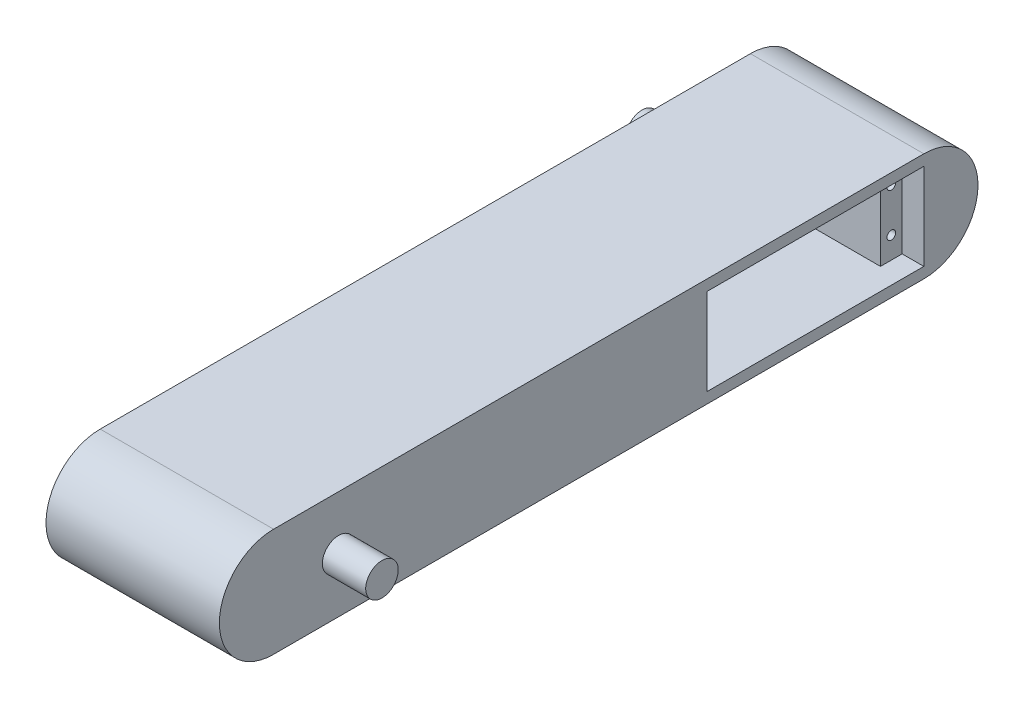
ISO-10303-21;
HEADER;
FILE_DESCRIPTION(('STEP AP214'),'2;1');
FILE_NAME('part.step','',(''),(''),'','','');
FILE_SCHEMA(('AUTOMOTIVE_DESIGN { 1 0 10303 214 1 1 1 1 }'));
ENDSEC;
DATA;
#1=APPLICATION_CONTEXT('core data for automotive mechanical design processes');
#2=APPLICATION_PROTOCOL_DEFINITION('international standard','automotive_design',2000,#1);
#3=PRODUCT_CONTEXT('',#1,'mechanical');
#4=PRODUCT('Part','Part','',(#3));
#5=PRODUCT_RELATED_PRODUCT_CATEGORY('part','',(#4));
#6=PRODUCT_DEFINITION_FORMATION('','',#4);
#7=PRODUCT_DEFINITION_CONTEXT('part definition',#1,'design');
#8=PRODUCT_DEFINITION('design','',#6,#7);
#9=PRODUCT_DEFINITION_SHAPE('','',#8);
#10=(LENGTH_UNIT() NAMED_UNIT(*) SI_UNIT(.MILLI.,.METRE.));
#11=(NAMED_UNIT(*) PLANE_ANGLE_UNIT() SI_UNIT($,.RADIAN.));
#12=(NAMED_UNIT(*) SI_UNIT($,.STERADIAN.) SOLID_ANGLE_UNIT());
#13=UNCERTAINTY_MEASURE_WITH_UNIT(LENGTH_MEASURE(1.E-05),#10,'distance_accuracy_value','');
#14=(GEOMETRIC_REPRESENTATION_CONTEXT(3) GLOBAL_UNCERTAINTY_ASSIGNED_CONTEXT((#13)) GLOBAL_UNIT_ASSIGNED_CONTEXT((#10,
#11,#12)) REPRESENTATION_CONTEXT('',''));
#15=CARTESIAN_POINT('',(0.,0.,0.));
#16=DIRECTION('',(0.,0.,1.));
#17=DIRECTION('',(1.,0.,0.));
#18=AXIS2_PLACEMENT_3D('',#15,#16,#17);
#19=CARTESIAN_POINT('',(17.5,0.,0.));
#20=DIRECTION('',(1.,0.,0.));
#21=DIRECTION('',(0.,0.,-1.));
#22=AXIS2_PLACEMENT_3D('',#19,#20,#21);
#23=PLANE('',#22);
#24=CARTESIAN_POINT('',(17.5,15.,-122.5));
#25=DIRECTION('',(1.,0.,0.));
#26=DIRECTION('',(0.,0.,-1.));
#27=AXIS2_PLACEMENT_3D('',#24,#25,#26);
#28=CIRCLE('',#27,0.999999999999987);
#29=CARTESIAN_POINT('',(17.5,15.,-123.5));
#30=VERTEX_POINT('',#29);
#31=EDGE_CURVE('E220',#30,#30,#28,.T.);
#32=ORIENTED_EDGE('',*,*,#31,.F.);
#33=EDGE_LOOP('',(#32));
#34=FACE_BOUND('',#33,.T.);
#35=CARTESIAN_POINT('',(17.5,5.,-122.5));
#36=DIRECTION('',(1.,0.,0.));
#37=DIRECTION('',(0.,0.,-1.));
#38=AXIS2_PLACEMENT_3D('',#35,#36,#37);
#39=CIRCLE('',#38,0.999999999999989);
#40=CARTESIAN_POINT('',(17.5,5.,-123.5));
#41=VERTEX_POINT('',#40);
#42=EDGE_CURVE('E226',#41,#41,#39,.T.);
#43=ORIENTED_EDGE('',*,*,#42,.F.);
#44=EDGE_LOOP('',(#43));
#45=FACE_BOUND('',#44,.T.);
#46=DIRECTION('',(0.,1.,0.));
#47=VECTOR('',#46,1.);
#48=CARTESIAN_POINT('',(17.5,0.,-120.));
#49=LINE('',#48,#47);
#50=CARTESIAN_POINT('',(17.5,0.,-120.));
#51=VERTEX_POINT('',#50);
#52=CARTESIAN_POINT('',(17.5,20.,-120.));
#53=VERTEX_POINT('',#52);
#54=EDGE_CURVE('E11',#51,#53,#49,.T.);
#55=ORIENTED_EDGE('',*,*,#54,.F.);
#56=DIRECTION('',(0.,0.,1.));
#57=VECTOR('',#56,1.);
#58=CARTESIAN_POINT('',(17.5,0.,-125.));
#59=LINE('',#58,#57);
#60=CARTESIAN_POINT('',(17.5,0.,-125.));
#61=VERTEX_POINT('',#60);
#62=EDGE_CURVE('E260',#61,#51,#59,.T.);
#63=ORIENTED_EDGE('',*,*,#62,.F.);
#64=DIRECTION('',(0.,-1.,0.));
#65=VECTOR('',#64,1.);
#66=CARTESIAN_POINT('',(17.5,20.,-125.));
#67=LINE('',#66,#65);
#68=CARTESIAN_POINT('',(17.5,20.,-125.));
#69=VERTEX_POINT('',#68);
#70=EDGE_CURVE('E263',#69,#61,#67,.T.);
#71=ORIENTED_EDGE('',*,*,#70,.F.);
#72=DIRECTION('',(0.,0.,1.));
#73=VECTOR('',#72,1.);
#74=CARTESIAN_POINT('',(17.5,20.,-125.));
#75=LINE('',#74,#73);
#76=EDGE_CURVE('E252',#69,#53,#75,.T.);
#77=ORIENTED_EDGE('',*,*,#76,.T.);
#78=EDGE_LOOP('',(#55,#63,#71,#77));
#79=FACE_BOUND('',#78,.T.);
#80=ADVANCED_FACE('F38',(#34,#45,#79),#23,.T.);
#81=CARTESIAN_POINT('',(-12.5,20.,0.));
#82=DIRECTION('',(1.,0.,0.));
#83=DIRECTION('',(0.,0.,-1.));
#84=AXIS2_PLACEMENT_3D('',#81,#82,#83);
#85=PLANE('',#84);
#86=CARTESIAN_POINT('',(-12.5,5.,22.5));
#87=DIRECTION('',(-1.,0.,0.));
#88=DIRECTION('',(0.,0.,1.));
#89=AXIS2_PLACEMENT_3D('',#86,#87,#88);
#90=CIRCLE('',#89,0.999999999999989);
#91=CARTESIAN_POINT('',(-12.5,5.,23.5));
#92=VERTEX_POINT('',#91);
#93=EDGE_CURVE('E357',#92,#92,#90,.T.);
#94=ORIENTED_EDGE('',*,*,#93,.F.);
#95=EDGE_LOOP('',(#94));
#96=FACE_BOUND('',#95,.T.);
#97=CARTESIAN_POINT('',(-12.5,15.,22.5));
#98=DIRECTION('',(-1.,0.,0.));
#99=DIRECTION('',(0.,0.,1.));
#100=AXIS2_PLACEMENT_3D('',#97,#98,#99);
#101=CIRCLE('',#100,0.999999999999987);
#102=CARTESIAN_POINT('',(-12.5,15.,23.5));
#103=VERTEX_POINT('',#102);
#104=EDGE_CURVE('E349',#103,#103,#101,.T.);
#105=ORIENTED_EDGE('',*,*,#104,.F.);
#106=EDGE_LOOP('',(#105));
#107=FACE_BOUND('',#106,.T.);
#108=DIRECTION('',(0.,-1.,0.));
#109=VECTOR('',#108,1.);
#110=CARTESIAN_POINT('',(-12.5,20.,20.));
#111=LINE('',#110,#109);
#112=CARTESIAN_POINT('',(-12.5,20.,20.));
#113=VERTEX_POINT('',#112);
#114=CARTESIAN_POINT('',(-12.5,0.,20.));
#115=VERTEX_POINT('',#114);
#116=EDGE_CURVE('E392',#113,#115,#111,.T.);
#117=ORIENTED_EDGE('',*,*,#116,.T.);
#118=DIRECTION('',(0.,0.,1.));
#119=VECTOR('',#118,1.);
#120=CARTESIAN_POINT('',(-12.5,0.,0.));
#121=LINE('',#120,#119);
#122=CARTESIAN_POINT('',(-12.5,0.,25.));
#123=VERTEX_POINT('',#122);
#124=EDGE_CURVE('E315',#115,#123,#121,.T.);
#125=ORIENTED_EDGE('',*,*,#124,.T.);
#126=DIRECTION('',(0.,-1.,0.));
#127=VECTOR('',#126,1.);
#128=CARTESIAN_POINT('',(-12.5,20.,25.));
#129=LINE('',#128,#127);
#130=CARTESIAN_POINT('',(-12.5,20.,25.));
#131=VERTEX_POINT('',#130);
#132=EDGE_CURVE('E384',#131,#123,#129,.T.);
#133=ORIENTED_EDGE('',*,*,#132,.F.);
#134=DIRECTION('',(0.,0.,1.));
#135=VECTOR('',#134,1.);
#136=CARTESIAN_POINT('',(-12.5,20.,0.));
#137=LINE('',#136,#135);
#138=EDGE_CURVE('E319',#113,#131,#137,.T.);
#139=ORIENTED_EDGE('',*,*,#138,.F.);
#140=EDGE_LOOP('',(#117,#125,#133,#139));
#141=FACE_BOUND('',#140,.T.);
#142=ADVANCED_FACE('F415',(#96,#107,#141),#85,.F.);
#143=CARTESIAN_POINT('',(22.5,20.,0.));
#144=DIRECTION('',(1.,0.,0.));
#145=DIRECTION('',(0.,0.,-1.));
#146=AXIS2_PLACEMENT_3D('',#143,#144,#145);
#147=PLANE('',#146);
#148=DIRECTION('',(0.,0.,1.));
#149=VECTOR('',#148,1.);
#150=CARTESIAN_POINT('',(22.5,20.,-125.));
#151=LINE('',#150,#149);
#152=CARTESIAN_POINT('',(22.5,20.,-125.));
#153=VERTEX_POINT('',#152);
#154=CARTESIAN_POINT('',(22.5,20.,-75.));
#155=VERTEX_POINT('',#154);
#156=EDGE_CURVE('E59',#153,#155,#151,.T.);
#157=ORIENTED_EDGE('',*,*,#156,.F.);
#158=DIRECTION('',(0.,-1.,0.));
#159=VECTOR('',#158,1.);
#160=CARTESIAN_POINT('',(22.5,20.,-125.));
#161=LINE('',#160,#159);
#162=CARTESIAN_POINT('',(22.5,0.,-125.));
#163=VERTEX_POINT('',#162);
#164=EDGE_CURVE('E272',#153,#163,#161,.T.);
#165=ORIENTED_EDGE('',*,*,#164,.T.);
#166=DIRECTION('',(0.,0.,1.));
#167=VECTOR('',#166,1.);
#168=CARTESIAN_POINT('',(22.5,0.,-125.));
#169=LINE('',#168,#167);
#170=CARTESIAN_POINT('',(22.5,0.,-75.));
#171=VERTEX_POINT('',#170);
#172=EDGE_CURVE('E270',#163,#171,#169,.T.);
#173=ORIENTED_EDGE('',*,*,#172,.T.);
#174=DIRECTION('',(0.,-1.,0.));
#175=VECTOR('',#174,1.);
#176=CARTESIAN_POINT('',(22.5,20.,-75.));
#177=LINE('',#176,#175);
#178=EDGE_CURVE('E267',#155,#171,#177,.T.);
#179=ORIENTED_EDGE('',*,*,#178,.F.);
#180=EDGE_LOOP('',(#157,#165,#173,#179));
#181=FACE_BOUND('',#180,.T.);
#182=CARTESIAN_POINT('',(22.5,10.,9.99999999999999));
#183=DIRECTION('',(1.,0.,0.));
#184=DIRECTION('',(0.,0.,-1.));
#185=AXIS2_PLACEMENT_3D('',#182,#183,#184);
#186=CIRCLE('',#185,3.75);
#187=CARTESIAN_POINT('',(22.5,10.,6.25));
#188=VERTEX_POINT('',#187);
#189=EDGE_CURVE('E345',#188,#188,#186,.T.);
#190=ORIENTED_EDGE('',*,*,#189,.F.);
#191=EDGE_LOOP('',(#190));
#192=FACE_BOUND('',#191,.T.);
#193=DIRECTION('',(0.,0.,-1.));
#194=VECTOR('',#193,1.);
#195=CARTESIAN_POINT('',(22.5,22.5,25.));
#196=LINE('',#195,#194);
#197=CARTESIAN_POINT('',(22.5,22.5,25.));
#198=VERTEX_POINT('',#197);
#199=CARTESIAN_POINT('',(22.5,22.5,-125.));
#200=VERTEX_POINT('',#199);
#201=EDGE_CURVE('E339',#198,#200,#196,.T.);
#202=ORIENTED_EDGE('',*,*,#201,.F.);
#203=CARTESIAN_POINT('',(22.5,10.,25.));
#204=DIRECTION('',(1.,0.,0.));
#205=DIRECTION('',(0.,0.,-1.));
#206=AXIS2_PLACEMENT_3D('',#203,#204,#205);
#207=CIRCLE('',#206,12.5);
#208=CARTESIAN_POINT('',(22.5,-2.5,25.));
#209=VERTEX_POINT('',#208);
#210=EDGE_CURVE('E277',#198,#209,#207,.T.);
#211=ORIENTED_EDGE('',*,*,#210,.T.);
#212=DIRECTION('',(0.,0.,1.));
#213=VECTOR('',#212,1.);
#214=CARTESIAN_POINT('',(22.5,-2.5,-25.));
#215=LINE('',#214,#213);
#216=CARTESIAN_POINT('',(22.5,-2.49999999999999,-125.));
#217=VERTEX_POINT('',#216);
#218=EDGE_CURVE('E333',#217,#209,#215,.T.);
#219=ORIENTED_EDGE('',*,*,#218,.F.);
#220=CARTESIAN_POINT('',(22.5,10.,-125.));
#221=DIRECTION('',(1.,0.,0.));
#222=DIRECTION('',(0.,0.,-1.));
#223=AXIS2_PLACEMENT_3D('',#220,#221,#222);
#224=CIRCLE('',#223,12.5);
#225=EDGE_CURVE('E288',#200,#217,#224,.F.);
#226=ORIENTED_EDGE('',*,*,#225,.F.);
#227=EDGE_LOOP('',(#202,#211,#219,#226));
#228=FACE_BOUND('',#227,.T.);
#229=ADVANCED_FACE('F40',(#181,#192,#228),#147,.T.);
#230=CARTESIAN_POINT('',(0.,20.,-20.));
#231=DIRECTION('',(0.,0.,-1.));
#232=DIRECTION('',(-1.,0.,0.));
#233=AXIS2_PLACEMENT_3D('',#230,#231,#232);
#234=PLANE('',#233);
#235=DIRECTION('',(1.,0.,0.));
#236=VECTOR('',#235,1.);
#237=CARTESIAN_POINT('',(0.,0.,-20.));
#238=LINE('',#237,#236);
#239=CARTESIAN_POINT('',(-12.5,0.,-20.));
#240=VERTEX_POINT('',#239);
#241=CARTESIAN_POINT('',(17.5,0.,-20.));
#242=VERTEX_POINT('',#241);
#243=EDGE_CURVE('E375',#240,#242,#238,.T.);
#244=ORIENTED_EDGE('',*,*,#243,.T.);
#245=DIRECTION('',(0.,-1.,0.));
#246=VECTOR('',#245,1.);
#247=CARTESIAN_POINT('',(17.5,20.,-20.));
#248=LINE('',#247,#246);
#249=CARTESIAN_POINT('',(17.5,20.,-20.));
#250=VERTEX_POINT('',#249);
#251=EDGE_CURVE('E398',#250,#242,#248,.T.);
#252=ORIENTED_EDGE('',*,*,#251,.F.);
#253=DIRECTION('',(1.,0.,0.));
#254=VECTOR('',#253,1.);
#255=CARTESIAN_POINT('',(0.,20.,-20.));
#256=LINE('',#255,#254);
#257=CARTESIAN_POINT('',(-12.5,20.,-20.));
#258=VERTEX_POINT('',#257);
#259=EDGE_CURVE('E376',#258,#250,#256,.T.);
#260=ORIENTED_EDGE('',*,*,#259,.F.);
#261=DIRECTION('',(0.,-1.,0.));
#262=VECTOR('',#261,1.);
#263=CARTESIAN_POINT('',(-12.5,20.,-20.));
#264=LINE('',#263,#262);
#265=EDGE_CURVE('E401',#258,#240,#264,.T.);
#266=ORIENTED_EDGE('',*,*,#265,.T.);
#267=EDGE_LOOP('',(#244,#252,#260,#266));
#268=FACE_BOUND('',#267,.T.);
#269=ADVANCED_FACE('F437',(#268),#234,.F.);
#270=CARTESIAN_POINT('',(17.5,20.,0.));
#271=DIRECTION('',(1.,0.,0.));
#272=DIRECTION('',(0.,0.,-1.));
#273=AXIS2_PLACEMENT_3D('',#270,#271,#272);
#274=PLANE('',#273);
#275=DIRECTION('',(0.,0.,1.));
#276=VECTOR('',#275,1.);
#277=CARTESIAN_POINT('',(17.5,0.,0.));
#278=LINE('',#277,#276);
#279=CARTESIAN_POINT('',(17.5,0.,20.));
#280=VERTEX_POINT('',#279);
#281=EDGE_CURVE('E387',#242,#280,#278,.T.);
#282=ORIENTED_EDGE('',*,*,#281,.T.);
#283=DIRECTION('',(0.,-1.,0.));
#284=VECTOR('',#283,1.);
#285=CARTESIAN_POINT('',(17.5,20.,20.));
#286=LINE('',#285,#284);
#287=CARTESIAN_POINT('',(17.5,20.,20.));
#288=VERTEX_POINT('',#287);
#289=EDGE_CURVE('E395',#288,#280,#286,.T.);
#290=ORIENTED_EDGE('',*,*,#289,.F.);
#291=DIRECTION('',(0.,0.,1.));
#292=VECTOR('',#291,1.);
#293=CARTESIAN_POINT('',(17.5,20.,0.));
#294=LINE('',#293,#292);
#295=EDGE_CURVE('E378',#250,#288,#294,.T.);
#296=ORIENTED_EDGE('',*,*,#295,.F.);
#297=ORIENTED_EDGE('',*,*,#251,.T.);
#298=EDGE_LOOP('',(#282,#290,#296,#297));
#299=FACE_BOUND('',#298,.T.);
#300=ADVANCED_FACE('F441',(#299),#274,.F.);
#301=CARTESIAN_POINT('',(0.,20.,20.));
#302=DIRECTION('',(0.,0.,-1.));
#303=DIRECTION('',(-1.,0.,0.));
#304=AXIS2_PLACEMENT_3D('',#301,#302,#303);
#305=PLANE('',#304);
#306=DIRECTION('',(1.,0.,0.));
#307=VECTOR('',#306,1.);
#308=CARTESIAN_POINT('',(0.,0.,20.));
#309=LINE('',#308,#307);
#310=EDGE_CURVE('E379',#115,#280,#309,.T.);
#311=ORIENTED_EDGE('',*,*,#310,.F.);
#312=ORIENTED_EDGE('',*,*,#116,.F.);
#313=DIRECTION('',(1.,0.,0.));
#314=VECTOR('',#313,1.);
#315=CARTESIAN_POINT('',(0.,20.,20.));
#316=LINE('',#315,#314);
#317=EDGE_CURVE('E381',#113,#288,#316,.T.);
#318=ORIENTED_EDGE('',*,*,#317,.T.);
#319=ORIENTED_EDGE('',*,*,#289,.T.);
#320=EDGE_LOOP('',(#311,#312,#318,#319));
#321=FACE_BOUND('',#320,.T.);
#322=ADVANCED_FACE('F444',(#321),#305,.T.);
#323=DIRECTION('',(0.,-1.,0.));
#324=VECTOR('',#323,1.);
#325=CARTESIAN_POINT('',(-12.5,0.,-25.));
#326=LINE('',#325,#324);
#327=CARTESIAN_POINT('',(-12.5,20.,-25.));
#328=VERTEX_POINT('',#327);
#329=CARTESIAN_POINT('',(-12.5,0.,-25.));
#330=VERTEX_POINT('',#329);
#331=EDGE_CURVE('E314',#328,#330,#326,.T.);
#332=ORIENTED_EDGE('',*,*,#331,.T.);
#333=EDGE_CURVE('E294',#330,#240,#121,.T.);
#334=ORIENTED_EDGE('',*,*,#333,.T.);
#335=ORIENTED_EDGE('',*,*,#265,.F.);
#336=EDGE_CURVE('E300',#328,#258,#137,.T.);
#337=ORIENTED_EDGE('',*,*,#336,.F.);
#338=EDGE_LOOP('',(#332,#334,#335,#337));
#339=FACE_BOUND('',#338,.T.);
#340=CARTESIAN_POINT('',(-12.5,15.,-22.5));
#341=DIRECTION('',(-1.,0.,0.));
#342=DIRECTION('',(0.,0.,1.));
#343=AXIS2_PLACEMENT_3D('',#340,#341,#342);
#344=CIRCLE('',#343,0.999999999999987);
#345=CARTESIAN_POINT('',(-12.5,15.,-21.5));
#346=VERTEX_POINT('',#345);
#347=EDGE_CURVE('E363',#346,#346,#344,.T.);
#348=ORIENTED_EDGE('',*,*,#347,.F.);
#349=EDGE_LOOP('',(#348));
#350=FACE_BOUND('',#349,.T.);
#351=CARTESIAN_POINT('',(-12.5,5.,-22.5));
#352=DIRECTION('',(-1.,0.,0.));
#353=DIRECTION('',(0.,0.,1.));
#354=AXIS2_PLACEMENT_3D('',#351,#352,#353);
#355=CIRCLE('',#354,0.999999999999989);
#356=CARTESIAN_POINT('',(-12.5,5.,-21.5));
#357=VERTEX_POINT('',#356);
#358=EDGE_CURVE('E369',#357,#357,#355,.T.);
#359=ORIENTED_EDGE('',*,*,#358,.F.);
#360=EDGE_LOOP('',(#359));
#361=FACE_BOUND('',#360,.T.);
#362=ADVANCED_FACE('F434',(#339,#350,#361),#85,.F.);
#363=CARTESIAN_POINT('',(-2.50000000000001,5.,-22.5));
#364=DIRECTION('',(-1.,0.,0.));
#365=DIRECTION('',(0.,0.,1.));
#366=AXIS2_PLACEMENT_3D('',#363,#364,#365);
#367=CONICAL_SURFACE('',#366,0.999999999999987,1.02974425867664);
#368=CARTESIAN_POINT('',(-1.89913938097244,5.,-22.5));
#369=VERTEX_POINT('',#368);
#370=VERTEX_LOOP('',#369);
#371=FACE_BOUND('',#370,.T.);
#372=CARTESIAN_POINT('',(-2.50000000000001,5.,-22.5));
#373=DIRECTION('',(-1.,0.,0.));
#374=DIRECTION('',(0.,0.,1.));
#375=AXIS2_PLACEMENT_3D('',#372,#373,#374);
#376=CIRCLE('',#375,0.999999999999987);
#377=CARTESIAN_POINT('',(-2.50000000000001,5.,-21.5));
#378=VERTEX_POINT('',#377);
#379=EDGE_CURVE('E372',#378,#378,#376,.T.);
#380=ORIENTED_EDGE('',*,*,#379,.T.);
#381=EDGE_LOOP('',(#380));
#382=FACE_BOUND('',#381,.T.);
#383=ADVANCED_FACE('F451',(#371,#382),#367,.F.);
#384=CARTESIAN_POINT('',(-12.5,5.,-22.5));
#385=DIRECTION('',(-1.,0.,0.));
#386=DIRECTION('',(0.,0.,1.));
#387=AXIS2_PLACEMENT_3D('',#384,#385,#386);
#388=CYLINDRICAL_SURFACE('',#387,0.999999999999988);
#389=ORIENTED_EDGE('',*,*,#379,.F.);
#390=EDGE_LOOP('',(#389));
#391=FACE_BOUND('',#390,.T.);
#392=ORIENTED_EDGE('',*,*,#358,.T.);
#393=EDGE_LOOP('',(#392));
#394=FACE_BOUND('',#393,.T.);
#395=ADVANCED_FACE('F578',(#391,#394),#388,.F.);
#396=CARTESIAN_POINT('',(-2.50000000000001,15.,-22.5));
#397=DIRECTION('',(-1.,0.,0.));
#398=DIRECTION('',(0.,0.,1.));
#399=AXIS2_PLACEMENT_3D('',#396,#397,#398);
#400=CONICAL_SURFACE('',#399,0.999999999999987,1.02974425867664);
#401=CARTESIAN_POINT('',(-1.89913938097244,15.,-22.5));
#402=VERTEX_POINT('',#401);
#403=VERTEX_LOOP('',#402);
#404=FACE_BOUND('',#403,.T.);
#405=CARTESIAN_POINT('',(-2.50000000000001,15.,-22.5));
#406=DIRECTION('',(-1.,0.,0.));
#407=DIRECTION('',(0.,0.,1.));
#408=AXIS2_PLACEMENT_3D('',#405,#406,#407);
#409=CIRCLE('',#408,0.999999999999987);
#410=CARTESIAN_POINT('',(-2.50000000000001,15.,-21.5));
#411=VERTEX_POINT('',#410);
#412=EDGE_CURVE('E366',#411,#411,#409,.T.);
#413=ORIENTED_EDGE('',*,*,#412,.T.);
#414=EDGE_LOOP('',(#413));
#415=FACE_BOUND('',#414,.T.);
#416=ADVANCED_FACE('F574',(#404,#415),#400,.F.);
#417=CARTESIAN_POINT('',(-12.5,15.,-22.5));
#418=DIRECTION('',(-1.,0.,0.));
#419=DIRECTION('',(0.,0.,1.));
#420=AXIS2_PLACEMENT_3D('',#417,#418,#419);
#421=CYLINDRICAL_SURFACE('',#420,0.999999999999987);
#422=ORIENTED_EDGE('',*,*,#412,.F.);
#423=EDGE_LOOP('',(#422));
#424=FACE_BOUND('',#423,.T.);
#425=ORIENTED_EDGE('',*,*,#347,.T.);
#426=EDGE_LOOP('',(#425));
#427=FACE_BOUND('',#426,.T.);
#428=ADVANCED_FACE('F570',(#424,#427),#421,.F.);
#429=CARTESIAN_POINT('',(-2.50000000000001,5.,22.5));
#430=DIRECTION('',(-1.,0.,0.));
#431=DIRECTION('',(0.,0.,1.));
#432=AXIS2_PLACEMENT_3D('',#429,#430,#431);
#433=CONICAL_SURFACE('',#432,0.999999999999987,1.02974425867664);
#434=CARTESIAN_POINT('',(-1.89913938097244,5.,22.5));
#435=VERTEX_POINT('',#434);
#436=VERTEX_LOOP('',#435);
#437=FACE_BOUND('',#436,.T.);
#438=CARTESIAN_POINT('',(-2.50000000000001,5.,22.5));
#439=DIRECTION('',(-1.,0.,0.));
#440=DIRECTION('',(0.,0.,1.));
#441=AXIS2_PLACEMENT_3D('',#438,#439,#440);
#442=CIRCLE('',#441,0.999999999999987);
#443=CARTESIAN_POINT('',(-2.50000000000001,5.,23.5));
#444=VERTEX_POINT('',#443);
#445=EDGE_CURVE('E360',#444,#444,#442,.T.);
#446=ORIENTED_EDGE('',*,*,#445,.T.);
#447=EDGE_LOOP('',(#446));
#448=FACE_BOUND('',#447,.T.);
#449=ADVANCED_FACE('F566',(#437,#448),#433,.F.);
#450=CARTESIAN_POINT('',(-12.5,5.,22.5));
#451=DIRECTION('',(-1.,0.,0.));
#452=DIRECTION('',(0.,0.,1.));
#453=AXIS2_PLACEMENT_3D('',#450,#451,#452);
#454=CYLINDRICAL_SURFACE('',#453,0.999999999999988);
#455=ORIENTED_EDGE('',*,*,#445,.F.);
#456=EDGE_LOOP('',(#455));
#457=FACE_BOUND('',#456,.T.);
#458=ORIENTED_EDGE('',*,*,#93,.T.);
#459=EDGE_LOOP('',(#458));
#460=FACE_BOUND('',#459,.T.);
#461=ADVANCED_FACE('F562',(#457,#460),#454,.F.);
#462=CARTESIAN_POINT('',(-2.50000000000001,15.,22.5));
#463=DIRECTION('',(-1.,0.,0.));
#464=DIRECTION('',(0.,0.,1.));
#465=AXIS2_PLACEMENT_3D('',#462,#463,#464);
#466=CONICAL_SURFACE('',#465,0.999999999999987,1.02974425867664);
#467=CARTESIAN_POINT('',(-1.89913938097244,15.,22.5));
#468=VERTEX_POINT('',#467);
#469=VERTEX_LOOP('',#468);
#470=FACE_BOUND('',#469,.T.);
#471=CARTESIAN_POINT('',(-2.50000000000001,15.,22.5));
#472=DIRECTION('',(-1.,0.,0.));
#473=DIRECTION('',(0.,0.,1.));
#474=AXIS2_PLACEMENT_3D('',#471,#472,#473);
#475=CIRCLE('',#474,0.999999999999987);
#476=CARTESIAN_POINT('',(-2.50000000000001,15.,23.5));
#477=VERTEX_POINT('',#476);
#478=EDGE_CURVE('E354',#477,#477,#475,.T.);
#479=ORIENTED_EDGE('',*,*,#478,.T.);
#480=EDGE_LOOP('',(#479));
#481=FACE_BOUND('',#480,.T.);
#482=ADVANCED_FACE('F558',(#470,#481),#466,.F.);
#483=CARTESIAN_POINT('',(-12.5,15.,22.5));
#484=DIRECTION('',(-1.,0.,0.));
#485=DIRECTION('',(0.,0.,1.));
#486=AXIS2_PLACEMENT_3D('',#483,#484,#485);
#487=CYLINDRICAL_SURFACE('',#486,0.999999999999987);
#488=ORIENTED_EDGE('',*,*,#478,.F.);
#489=EDGE_LOOP('',(#488));
#490=FACE_BOUND('',#489,.T.);
#491=ORIENTED_EDGE('',*,*,#104,.T.);
#492=EDGE_LOOP('',(#491));
#493=FACE_BOUND('',#492,.T.);
#494=ADVANCED_FACE('F554',(#490,#493),#487,.F.);
#495=CARTESIAN_POINT('',(32.5,10.,9.99999999999999));
#496=DIRECTION('',(-1.,0.,0.));
#497=DIRECTION('',(0.,0.,1.));
#498=AXIS2_PLACEMENT_3D('',#495,#496,#497);
#499=CYLINDRICAL_SURFACE('',#498,3.75);
#500=CARTESIAN_POINT('',(32.5,10.,9.99999999999999));
#501=DIRECTION('',(1.,0.,0.));
#502=DIRECTION('',(0.,0.,-1.));
#503=AXIS2_PLACEMENT_3D('',#500,#501,#502);
#504=CIRCLE('',#503,3.75);
#505=CARTESIAN_POINT('',(32.5,10.,6.24999999999999));
#506=VERTEX_POINT('',#505);
#507=EDGE_CURVE('E346',#506,#506,#504,.T.);
#508=ORIENTED_EDGE('',*,*,#507,.F.);
#509=EDGE_LOOP('',(#508));
#510=FACE_BOUND('',#509,.T.);
#511=ORIENTED_EDGE('',*,*,#189,.T.);
#512=EDGE_LOOP('',(#511));
#513=FACE_BOUND('',#512,.T.);
#514=ADVANCED_FACE('F550',(#510,#513),#499,.T.);
#515=CARTESIAN_POINT('',(32.5,0.,0.));
#516=DIRECTION('',(1.,0.,0.));
#517=DIRECTION('',(0.,0.,-1.));
#518=AXIS2_PLACEMENT_3D('',#515,#516,#517);
#519=PLANE('',#518);
#520=ORIENTED_EDGE('',*,*,#507,.T.);
#521=EDGE_LOOP('',(#520));
#522=FACE_BOUND('',#521,.T.);
#523=ADVANCED_FACE('F547',(#522),#519,.T.);
#524=CARTESIAN_POINT('',(0.,20.,0.));
#525=DIRECTION('',(0.,1.,0.));
#526=DIRECTION('',(0.,0.,1.));
#527=AXIS2_PLACEMENT_3D('',#524,#525,#526);
#528=PLANE('',#527);
#529=ORIENTED_EDGE('',*,*,#317,.F.);
#530=ORIENTED_EDGE('',*,*,#138,.T.);
#531=DIRECTION('',(1.,0.,0.));
#532=VECTOR('',#531,1.);
#533=CARTESIAN_POINT('',(-17.5,20.,25.));
#534=LINE('',#533,#532);
#535=CARTESIAN_POINT('',(-17.5,20.,25.));
#536=VERTEX_POINT('',#535);
#537=EDGE_CURVE('E322',#536,#131,#534,.T.);
#538=ORIENTED_EDGE('',*,*,#537,.F.);
#539=DIRECTION('',(0.,0.,1.));
#540=VECTOR('',#539,1.);
#541=CARTESIAN_POINT('',(-17.5,20.,0.));
#542=LINE('',#541,#540);
#543=CARTESIAN_POINT('',(-17.5,20.,-25.));
#544=VERTEX_POINT('',#543);
#545=EDGE_CURVE('E303',#544,#536,#542,.T.);
#546=ORIENTED_EDGE('',*,*,#545,.F.);
#547=DIRECTION('',(1.,0.,0.));
#548=VECTOR('',#547,1.);
#549=CARTESIAN_POINT('',(-17.5,20.,-25.));
#550=LINE('',#549,#548);
#551=EDGE_CURVE('E324',#544,#328,#550,.T.);
#552=ORIENTED_EDGE('',*,*,#551,.T.);
#553=ORIENTED_EDGE('',*,*,#336,.T.);
#554=ORIENTED_EDGE('',*,*,#259,.T.);
#555=ORIENTED_EDGE('',*,*,#295,.T.);
#556=EDGE_LOOP('',(#529,#530,#538,#546,#552,#553,#554,#555));
#557=FACE_BOUND('',#556,.T.);
#558=ADVANCED_FACE('F412',(#557),#528,.F.);
#559=CARTESIAN_POINT('',(0.,22.5,0.));
#560=DIRECTION('',(0.,1.,0.));
#561=DIRECTION('',(0.,0.,1.));
#562=AXIS2_PLACEMENT_3D('',#559,#560,#561);
#563=PLANE('',#562);
#564=ORIENTED_EDGE('',*,*,#201,.T.);
#565=DIRECTION('',(1.,0.,0.));
#566=VECTOR('',#565,1.);
#567=CARTESIAN_POINT('',(-12.5,22.5,-125.));
#568=LINE('',#567,#566);
#569=CARTESIAN_POINT('',(-17.5,22.5,-125.));
#570=VERTEX_POINT('',#569);
#571=EDGE_CURVE('E329',#570,#200,#568,.T.);
#572=ORIENTED_EDGE('',*,*,#571,.F.);
#573=DIRECTION('',(0.,0.,-1.));
#574=VECTOR('',#573,1.);
#575=CARTESIAN_POINT('',(-17.5,22.5,0.));
#576=LINE('',#575,#574);
#577=CARTESIAN_POINT('',(-17.5,22.5,25.));
#578=VERTEX_POINT('',#577);
#579=EDGE_CURVE('E306',#578,#570,#576,.T.);
#580=ORIENTED_EDGE('',*,*,#579,.F.);
#581=DIRECTION('',(1.,0.,0.));
#582=VECTOR('',#581,1.);
#583=CARTESIAN_POINT('',(22.5,22.5,25.));
#584=LINE('',#583,#582);
#585=EDGE_CURVE('E342',#578,#198,#584,.T.);
#586=ORIENTED_EDGE('',*,*,#585,.T.);
#587=EDGE_LOOP('',(#564,#572,#580,#586));
#588=FACE_BOUND('',#587,.T.);
#589=ADVANCED_FACE('F514',(#588),#563,.T.);
#590=CARTESIAN_POINT('',(0.,-2.5,0.));
#591=DIRECTION('',(0.,1.,0.));
#592=DIRECTION('',(0.,0.,1.));
#593=AXIS2_PLACEMENT_3D('',#590,#591,#592);
#594=PLANE('',#593);
#595=DIRECTION('',(-1.,0.,0.));
#596=VECTOR('',#595,1.);
#597=CARTESIAN_POINT('',(-12.5,-2.5,25.));
#598=LINE('',#597,#596);
#599=CARTESIAN_POINT('',(-17.5,-2.5,25.));
#600=VERTEX_POINT('',#599);
#601=EDGE_CURVE('E336',#209,#600,#598,.T.);
#602=ORIENTED_EDGE('',*,*,#601,.T.);
#603=DIRECTION('',(0.,0.,1.));
#604=VECTOR('',#603,1.);
#605=CARTESIAN_POINT('',(-17.5,-2.5,0.));
#606=LINE('',#605,#604);
#607=CARTESIAN_POINT('',(-17.5000000000001,-2.49999999999999,-125.));
#608=VERTEX_POINT('',#607);
#609=EDGE_CURVE('E309',#608,#600,#606,.T.);
#610=ORIENTED_EDGE('',*,*,#609,.F.);
#611=DIRECTION('',(-1.,0.,0.));
#612=VECTOR('',#611,1.);
#613=CARTESIAN_POINT('',(-12.5,-2.5,-125.));
#614=LINE('',#613,#612);
#615=EDGE_CURVE('E331',#217,#608,#614,.T.);
#616=ORIENTED_EDGE('',*,*,#615,.F.);
#617=ORIENTED_EDGE('',*,*,#218,.T.);
#618=EDGE_LOOP('',(#602,#610,#616,#617));
#619=FACE_BOUND('',#618,.T.);
#620=ADVANCED_FACE('F523',(#619),#594,.F.);
#621=CARTESIAN_POINT('',(0.,0.,0.));
#622=DIRECTION('',(0.,1.,0.));
#623=DIRECTION('',(0.,0.,1.));
#624=AXIS2_PLACEMENT_3D('',#621,#622,#623);
#625=PLANE('',#624);
#626=ORIENTED_EDGE('',*,*,#243,.F.);
#627=ORIENTED_EDGE('',*,*,#333,.F.);
#628=DIRECTION('',(1.,0.,0.));
#629=VECTOR('',#628,1.);
#630=CARTESIAN_POINT('',(-17.5,0.,-25.));
#631=LINE('',#630,#629);
#632=CARTESIAN_POINT('',(-17.5,0.,-25.));
#633=VERTEX_POINT('',#632);
#634=EDGE_CURVE('E326',#633,#330,#631,.T.);
#635=ORIENTED_EDGE('',*,*,#634,.F.);
#636=DIRECTION('',(0.,0.,1.));
#637=VECTOR('',#636,1.);
#638=CARTESIAN_POINT('',(-17.5,0.,0.));
#639=LINE('',#638,#637);
#640=CARTESIAN_POINT('',(-17.5,0.,25.));
#641=VERTEX_POINT('',#640);
#642=EDGE_CURVE('E296',#633,#641,#639,.T.);
#643=ORIENTED_EDGE('',*,*,#642,.T.);
#644=DIRECTION('',(1.,0.,0.));
#645=VECTOR('',#644,1.);
#646=CARTESIAN_POINT('',(-17.5,0.,25.));
#647=LINE('',#646,#645);
#648=EDGE_CURVE('E312',#641,#123,#647,.T.);
#649=ORIENTED_EDGE('',*,*,#648,.T.);
#650=ORIENTED_EDGE('',*,*,#124,.F.);
#651=ORIENTED_EDGE('',*,*,#310,.T.);
#652=ORIENTED_EDGE('',*,*,#281,.F.);
#653=EDGE_LOOP('',(#626,#627,#635,#643,#649,#650,#651,#652));
#654=FACE_BOUND('',#653,.T.);
#655=ADVANCED_FACE('F421',(#654),#625,.T.);
#656=CARTESIAN_POINT('',(-17.5,0.,-25.));
#657=DIRECTION('',(0.,0.,1.));
#658=DIRECTION('',(0.,-1.,0.));
#659=AXIS2_PLACEMENT_3D('',#656,#657,#658);
#660=PLANE('',#659);
#661=ORIENTED_EDGE('',*,*,#331,.F.);
#662=ORIENTED_EDGE('',*,*,#551,.F.);
#663=DIRECTION('',(0.,-1.,0.));
#664=VECTOR('',#663,1.);
#665=CARTESIAN_POINT('',(-17.5,0.,-25.));
#666=LINE('',#665,#664);
#667=EDGE_CURVE('E299',#544,#633,#666,.T.);
#668=ORIENTED_EDGE('',*,*,#667,.T.);
#669=ORIENTED_EDGE('',*,*,#634,.T.);
#670=EDGE_LOOP('',(#661,#662,#668,#669));
#671=FACE_BOUND('',#670,.T.);
#672=ADVANCED_FACE('F428',(#671),#660,.T.);
#673=CARTESIAN_POINT('',(-17.5,0.,0.));
#674=DIRECTION('',(-1.,0.,0.));
#675=DIRECTION('',(0.,0.,1.));
#676=AXIS2_PLACEMENT_3D('',#673,#674,#675);
#677=PLANE('',#676);
#678=CARTESIAN_POINT('',(-17.5,10.,-110.));
#679=DIRECTION('',(-1.,0.,0.));
#680=DIRECTION('',(0.,0.,1.));
#681=AXIS2_PLACEMENT_3D('',#678,#679,#680);
#682=CIRCLE('',#681,3.75000000000001);
#683=CARTESIAN_POINT('',(-17.5,10.,-106.25));
#684=VERTEX_POINT('',#683);
#685=EDGE_CURVE('E993',#684,#684,#682,.T.);
#686=ORIENTED_EDGE('',*,*,#685,.F.);
#687=EDGE_LOOP('',(#686));
#688=FACE_BOUND('',#687,.T.);
#689=CARTESIAN_POINT('',(-17.5,10.,25.));
#690=DIRECTION('',(1.,0.,0.));
#691=DIRECTION('',(0.,0.,-1.));
#692=AXIS2_PLACEMENT_3D('',#689,#690,#691);
#693=CIRCLE('',#692,12.5);
#694=EDGE_CURVE('E284',#578,#600,#693,.T.);
#695=ORIENTED_EDGE('',*,*,#694,.F.);
#696=ORIENTED_EDGE('',*,*,#579,.T.);
#697=CARTESIAN_POINT('',(-17.5,10.,-125.));
#698=DIRECTION('',(1.,0.,0.));
#699=DIRECTION('',(0.,0.,-1.));
#700=AXIS2_PLACEMENT_3D('',#697,#698,#699);
#701=CIRCLE('',#700,12.5);
#702=EDGE_CURVE('E291',#570,#608,#701,.F.);
#703=ORIENTED_EDGE('',*,*,#702,.T.);
#704=ORIENTED_EDGE('',*,*,#609,.T.);
#705=EDGE_LOOP('',(#695,#696,#703,#704));
#706=FACE_BOUND('',#705,.T.);
#707=ORIENTED_EDGE('',*,*,#642,.F.);
#708=ORIENTED_EDGE('',*,*,#667,.F.);
#709=ORIENTED_EDGE('',*,*,#545,.T.);
#710=DIRECTION('',(0.,1.,0.));
#711=VECTOR('',#710,1.);
#712=CARTESIAN_POINT('',(-17.5,-2.5,25.));
#713=LINE('',#712,#711);
#714=EDGE_CURVE('E286',#641,#536,#713,.T.);
#715=ORIENTED_EDGE('',*,*,#714,.F.);
#716=EDGE_LOOP('',(#707,#708,#709,#715));
#717=FACE_BOUND('',#716,.T.);
#718=ADVANCED_FACE('F425',(#688,#706,#717),#677,.T.);
#719=CARTESIAN_POINT('',(-17.5,10.,-125.));
#720=DIRECTION('',(1.,0.,0.));
#721=DIRECTION('',(0.,0.,-1.));
#722=AXIS2_PLACEMENT_3D('',#719,#720,#721);
#723=CYLINDRICAL_SURFACE('',#722,12.5);
#724=ORIENTED_EDGE('',*,*,#225,.T.);
#725=ORIENTED_EDGE('',*,*,#615,.T.);
#726=ORIENTED_EDGE('',*,*,#702,.F.);
#727=ORIENTED_EDGE('',*,*,#571,.T.);
#728=EDGE_LOOP('',(#724,#725,#726,#727));
#729=FACE_BOUND('',#728,.T.);
#730=ADVANCED_FACE('F525',(#729),#723,.T.);
#731=CARTESIAN_POINT('',(-17.5,-2.5,25.));
#732=DIRECTION('',(0.,0.,-1.));
#733=DIRECTION('',(-1.,0.,0.));
#734=AXIS2_PLACEMENT_3D('',#731,#732,#733);
#735=PLANE('',#734);
#736=ORIENTED_EDGE('',*,*,#537,.T.);
#737=ORIENTED_EDGE('',*,*,#132,.T.);
#738=ORIENTED_EDGE('',*,*,#648,.F.);
#739=ORIENTED_EDGE('',*,*,#714,.T.);
#740=EDGE_LOOP('',(#736,#737,#738,#739));
#741=FACE_BOUND('',#740,.T.);
#742=ADVANCED_FACE('F418',(#741),#735,.T.);
#743=CARTESIAN_POINT('',(-17.5,10.,25.));
#744=DIRECTION('',(1.,0.,0.));
#745=DIRECTION('',(0.,0.,-1.));
#746=AXIS2_PLACEMENT_3D('',#743,#744,#745);
#747=CYLINDRICAL_SURFACE('',#746,12.5);
#748=ORIENTED_EDGE('',*,*,#210,.F.);
#749=ORIENTED_EDGE('',*,*,#585,.F.);
#750=ORIENTED_EDGE('',*,*,#694,.T.);
#751=ORIENTED_EDGE('',*,*,#601,.F.);
#752=EDGE_LOOP('',(#748,#749,#750,#751));
#753=FACE_BOUND('',#752,.T.);
#754=ADVANCED_FACE('F518',(#753),#747,.T.);
#755=CARTESIAN_POINT('',(17.5,20.,-125.));
#756=DIRECTION('',(0.,1.,0.));
#757=DIRECTION('',(0.,0.,1.));
#758=AXIS2_PLACEMENT_3D('',#755,#756,#757);
#759=PLANE('',#758);
#760=CARTESIAN_POINT('',(17.5,20.,-80.));
#761=VERTEX_POINT('',#760);
#762=CARTESIAN_POINT('',(17.5,20.,-75.));
#763=VERTEX_POINT('',#762);
#764=EDGE_CURVE('E256',#761,#763,#75,.T.);
#765=ORIENTED_EDGE('',*,*,#764,.F.);
#766=DIRECTION('',(1.,0.,0.));
#767=VECTOR('',#766,1.);
#768=CARTESIAN_POINT('',(-12.5,20.,-80.));
#769=LINE('',#768,#767);
#770=CARTESIAN_POINT('',(-12.5,20.,-80.));
#771=VERTEX_POINT('',#770);
#772=EDGE_CURVE('E249',#771,#761,#769,.T.);
#773=ORIENTED_EDGE('',*,*,#772,.F.);
#774=DIRECTION('',(0.,0.,1.));
#775=VECTOR('',#774,1.);
#776=CARTESIAN_POINT('',(-12.5,20.,-120.));
#777=LINE('',#776,#775);
#778=CARTESIAN_POINT('',(-12.5,20.,-120.));
#779=VERTEX_POINT('',#778);
#780=EDGE_CURVE('E235',#779,#771,#777,.T.);
#781=ORIENTED_EDGE('',*,*,#780,.F.);
#782=DIRECTION('',(1.,0.,0.));
#783=VECTOR('',#782,1.);
#784=CARTESIAN_POINT('',(-12.5,20.,-120.));
#785=LINE('',#784,#783);
#786=EDGE_CURVE('E53',#779,#53,#785,.T.);
#787=ORIENTED_EDGE('',*,*,#786,.T.);
#788=ORIENTED_EDGE('',*,*,#76,.F.);
#789=DIRECTION('',(1.,0.,0.));
#790=VECTOR('',#789,1.);
#791=CARTESIAN_POINT('',(17.5,20.,-125.));
#792=LINE('',#791,#790);
#793=EDGE_CURVE('E275',#69,#153,#792,.T.);
#794=ORIENTED_EDGE('',*,*,#793,.T.);
#795=ORIENTED_EDGE('',*,*,#156,.T.);
#796=DIRECTION('',(1.,0.,0.));
#797=VECTOR('',#796,1.);
#798=CARTESIAN_POINT('',(17.5,20.,-75.));
#799=LINE('',#798,#797);
#800=EDGE_CURVE('E265',#763,#155,#799,.T.);
#801=ORIENTED_EDGE('',*,*,#800,.F.);
#802=EDGE_LOOP('',(#765,#773,#781,#787,#788,#794,#795,#801));
#803=FACE_BOUND('',#802,.T.);
#804=ADVANCED_FACE('F485',(#803),#759,.F.);
#805=CARTESIAN_POINT('',(17.5,20.,-125.));
#806=DIRECTION('',(0.,0.,1.));
#807=DIRECTION('',(1.,0.,0.));
#808=AXIS2_PLACEMENT_3D('',#805,#806,#807);
#809=PLANE('',#808);
#810=ORIENTED_EDGE('',*,*,#164,.F.);
#811=ORIENTED_EDGE('',*,*,#793,.F.);
#812=ORIENTED_EDGE('',*,*,#70,.T.);
#813=DIRECTION('',(1.,0.,0.));
#814=VECTOR('',#813,1.);
#815=CARTESIAN_POINT('',(17.5,0.,-125.));
#816=LINE('',#815,#814);
#817=EDGE_CURVE('E278',#61,#163,#816,.T.);
#818=ORIENTED_EDGE('',*,*,#817,.T.);
#819=EDGE_LOOP('',(#810,#811,#812,#818));
#820=FACE_BOUND('',#819,.T.);
#821=ADVANCED_FACE('F503',(#820),#809,.T.);
#822=CARTESIAN_POINT('',(17.5,0.,-125.));
#823=DIRECTION('',(0.,1.,0.));
#824=DIRECTION('',(0.,0.,1.));
#825=AXIS2_PLACEMENT_3D('',#822,#823,#824);
#826=PLANE('',#825);
#827=DIRECTION('',(1.,0.,0.));
#828=VECTOR('',#827,1.);
#829=CARTESIAN_POINT('',(17.5,0.,-75.));
#830=LINE('',#829,#828);
#831=CARTESIAN_POINT('',(17.5,0.,-75.));
#832=VERTEX_POINT('',#831);
#833=EDGE_CURVE('E280',#832,#171,#830,.T.);
#834=ORIENTED_EDGE('',*,*,#833,.T.);
#835=ORIENTED_EDGE('',*,*,#172,.F.);
#836=ORIENTED_EDGE('',*,*,#817,.F.);
#837=ORIENTED_EDGE('',*,*,#62,.T.);
#838=DIRECTION('',(1.,0.,0.));
#839=VECTOR('',#838,1.);
#840=CARTESIAN_POINT('',(-12.5,0.,-120.));
#841=LINE('',#840,#839);
#842=CARTESIAN_POINT('',(-12.5,0.,-120.));
#843=VERTEX_POINT('',#842);
#844=EDGE_CURVE('E244',#843,#51,#841,.T.);
#845=ORIENTED_EDGE('',*,*,#844,.F.);
#846=DIRECTION('',(0.,0.,-1.));
#847=VECTOR('',#846,1.);
#848=CARTESIAN_POINT('',(-12.5,0.,-120.));
#849=LINE('',#848,#847);
#850=CARTESIAN_POINT('',(-12.5,0.,-80.));
#851=VERTEX_POINT('',#850);
#852=EDGE_CURVE('E241',#851,#843,#849,.T.);
#853=ORIENTED_EDGE('',*,*,#852,.F.);
#854=DIRECTION('',(1.,0.,0.));
#855=VECTOR('',#854,1.);
#856=CARTESIAN_POINT('',(-12.5,0.,-80.));
#857=LINE('',#856,#855);
#858=CARTESIAN_POINT('',(17.5,0.,-80.));
#859=VERTEX_POINT('',#858);
#860=EDGE_CURVE('E246',#851,#859,#857,.T.);
#861=ORIENTED_EDGE('',*,*,#860,.T.);
#862=EDGE_CURVE('E259',#859,#832,#59,.T.);
#863=ORIENTED_EDGE('',*,*,#862,.T.);
#864=EDGE_LOOP('',(#834,#835,#836,#837,#845,#853,#861,#863));
#865=FACE_BOUND('',#864,.T.);
#866=ADVANCED_FACE('F476',(#865),#826,.T.);
#867=CARTESIAN_POINT('',(17.5,20.,-75.));
#868=DIRECTION('',(0.,0.,1.));
#869=DIRECTION('',(1.,0.,0.));
#870=AXIS2_PLACEMENT_3D('',#867,#868,#869);
#871=PLANE('',#870);
#872=ORIENTED_EDGE('',*,*,#178,.T.);
#873=ORIENTED_EDGE('',*,*,#833,.F.);
#874=DIRECTION('',(0.,-1.,0.));
#875=VECTOR('',#874,1.);
#876=CARTESIAN_POINT('',(17.5,20.,-75.));
#877=LINE('',#876,#875);
#878=EDGE_CURVE('E255',#763,#832,#877,.T.);
#879=ORIENTED_EDGE('',*,*,#878,.F.);
#880=ORIENTED_EDGE('',*,*,#800,.T.);
#881=EDGE_LOOP('',(#872,#873,#879,#880));
#882=FACE_BOUND('',#881,.T.);
#883=ADVANCED_FACE('F468',(#882),#871,.F.);
#884=CARTESIAN_POINT('',(17.5,15.,-77.5));
#885=DIRECTION('',(1.,0.,0.));
#886=DIRECTION('',(0.,0.,-1.));
#887=AXIS2_PLACEMENT_3D('',#884,#885,#886);
#888=CIRCLE('',#887,0.999999999999987);
#889=CARTESIAN_POINT('',(17.5,15.,-78.5));
#890=VERTEX_POINT('',#889);
#891=EDGE_CURVE('E208',#890,#890,#888,.T.);
#892=ORIENTED_EDGE('',*,*,#891,.F.);
#893=EDGE_LOOP('',(#892));
#894=FACE_BOUND('',#893,.T.);
#895=CARTESIAN_POINT('',(17.5,5.,-77.5));
#896=DIRECTION('',(1.,0.,0.));
#897=DIRECTION('',(0.,0.,-1.));
#898=AXIS2_PLACEMENT_3D('',#895,#896,#897);
#899=CIRCLE('',#898,0.999999999999989);
#900=CARTESIAN_POINT('',(17.5,5.,-78.5));
#901=VERTEX_POINT('',#900);
#902=EDGE_CURVE('E207',#901,#901,#899,.T.);
#903=ORIENTED_EDGE('',*,*,#902,.F.);
#904=EDGE_LOOP('',(#903));
#905=FACE_BOUND('',#904,.T.);
#906=DIRECTION('',(0.,-1.,0.));
#907=VECTOR('',#906,1.);
#908=CARTESIAN_POINT('',(17.5,0.,-80.));
#909=LINE('',#908,#907);
#910=EDGE_CURVE('E46',#761,#859,#909,.T.);
#911=ORIENTED_EDGE('',*,*,#910,.F.);
#912=ORIENTED_EDGE('',*,*,#764,.T.);
#913=ORIENTED_EDGE('',*,*,#878,.T.);
#914=ORIENTED_EDGE('',*,*,#862,.F.);
#915=EDGE_LOOP('',(#911,#912,#913,#914));
#916=FACE_BOUND('',#915,.T.);
#917=ADVANCED_FACE('F457',(#894,#905,#916),#23,.T.);
#918=CARTESIAN_POINT('',(-12.5,20.,-120.));
#919=DIRECTION('',(0.,0.,-1.));
#920=DIRECTION('',(-1.,0.,0.));
#921=AXIS2_PLACEMENT_3D('',#918,#919,#920);
#922=PLANE('',#921);
#923=ORIENTED_EDGE('',*,*,#54,.T.);
#924=ORIENTED_EDGE('',*,*,#786,.F.);
#925=DIRECTION('',(0.,1.,0.));
#926=VECTOR('',#925,1.);
#927=CARTESIAN_POINT('',(-12.5,20.,-120.));
#928=LINE('',#927,#926);
#929=EDGE_CURVE('E232',#843,#779,#928,.T.);
#930=ORIENTED_EDGE('',*,*,#929,.F.);
#931=ORIENTED_EDGE('',*,*,#844,.T.);
#932=EDGE_LOOP('',(#923,#924,#930,#931));
#933=FACE_BOUND('',#932,.T.);
#934=ADVANCED_FACE('F467',(#933),#922,.F.);
#935=CARTESIAN_POINT('',(-12.5,20.,-80.));
#936=DIRECTION('',(0.,0.,1.));
#937=DIRECTION('',(1.,0.,0.));
#938=AXIS2_PLACEMENT_3D('',#935,#936,#937);
#939=PLANE('',#938);
#940=ORIENTED_EDGE('',*,*,#910,.T.);
#941=ORIENTED_EDGE('',*,*,#860,.F.);
#942=DIRECTION('',(0.,-1.,0.));
#943=VECTOR('',#942,1.);
#944=CARTESIAN_POINT('',(-12.5,20.,-80.));
#945=LINE('',#944,#943);
#946=EDGE_CURVE('E238',#771,#851,#945,.T.);
#947=ORIENTED_EDGE('',*,*,#946,.F.);
#948=ORIENTED_EDGE('',*,*,#772,.T.);
#949=EDGE_LOOP('',(#940,#941,#947,#948));
#950=FACE_BOUND('',#949,.T.);
#951=ADVANCED_FACE('F474',(#950),#939,.F.);
#952=CARTESIAN_POINT('',(-12.5,0.,0.));
#953=DIRECTION('',(-1.,0.,0.));
#954=DIRECTION('',(0.,0.,1.));
#955=AXIS2_PLACEMENT_3D('',#952,#953,#954);
#956=PLANE('',#955);
#957=ORIENTED_EDGE('',*,*,#929,.T.);
#958=ORIENTED_EDGE('',*,*,#780,.T.);
#959=ORIENTED_EDGE('',*,*,#946,.T.);
#960=ORIENTED_EDGE('',*,*,#852,.T.);
#961=EDGE_LOOP('',(#957,#958,#959,#960));
#962=FACE_BOUND('',#961,.T.);
#963=ADVANCED_FACE('F495',(#962),#956,.F.);
#964=CARTESIAN_POINT('',(7.49999999999999,5.,-122.5));
#965=DIRECTION('',(1.,0.,0.));
#966=DIRECTION('',(0.,0.,-1.));
#967=AXIS2_PLACEMENT_3D('',#964,#965,#966);
#968=CONICAL_SURFACE('',#967,0.999999999999987,1.02974425867664);
#969=CARTESIAN_POINT('',(6.89913938097242,4.99999999999999,-122.5));
#970=VERTEX_POINT('',#969);
#971=VERTEX_LOOP('',#970);
#972=FACE_BOUND('',#971,.T.);
#973=CARTESIAN_POINT('',(7.49999999999999,5.,-122.5));
#974=DIRECTION('',(1.,0.,0.));
#975=DIRECTION('',(0.,0.,-1.));
#976=AXIS2_PLACEMENT_3D('',#973,#974,#975);
#977=CIRCLE('',#976,0.999999999999987);
#978=CARTESIAN_POINT('',(7.49999999999999,5.,-123.5));
#979=VERTEX_POINT('',#978);
#980=EDGE_CURVE('E229',#979,#979,#977,.T.);
#981=ORIENTED_EDGE('',*,*,#980,.T.);
#982=EDGE_LOOP('',(#981));
#983=FACE_BOUND('',#982,.T.);
#984=ADVANCED_FACE('F710',(#972,#983),#968,.F.);
#985=CARTESIAN_POINT('',(17.5,5.,-122.5));
#986=DIRECTION('',(1.,0.,0.));
#987=DIRECTION('',(0.,0.,-1.));
#988=AXIS2_PLACEMENT_3D('',#985,#986,#987);
#989=CYLINDRICAL_SURFACE('',#988,0.999999999999988);
#990=ORIENTED_EDGE('',*,*,#980,.F.);
#991=EDGE_LOOP('',(#990));
#992=FACE_BOUND('',#991,.T.);
#993=ORIENTED_EDGE('',*,*,#42,.T.);
#994=EDGE_LOOP('',(#993));
#995=FACE_BOUND('',#994,.T.);
#996=ADVANCED_FACE('F706',(#992,#995),#989,.F.);
#997=CARTESIAN_POINT('',(7.49999999999999,15.,-122.5));
#998=DIRECTION('',(1.,0.,0.));
#999=DIRECTION('',(0.,0.,-1.));
#1000=AXIS2_PLACEMENT_3D('',#997,#998,#999);
#1001=CONICAL_SURFACE('',#1000,0.999999999999987,1.02974425867664);
#1002=CARTESIAN_POINT('',(6.89913938097242,15.,-122.5));
#1003=VERTEX_POINT('',#1002);
#1004=VERTEX_LOOP('',#1003);
#1005=FACE_BOUND('',#1004,.T.);
#1006=CARTESIAN_POINT('',(7.49999999999999,15.,-122.5));
#1007=DIRECTION('',(1.,0.,0.));
#1008=DIRECTION('',(0.,0.,-1.));
#1009=AXIS2_PLACEMENT_3D('',#1006,#1007,#1008);
#1010=CIRCLE('',#1009,0.999999999999987);
#1011=CARTESIAN_POINT('',(7.49999999999999,15.,-123.5));
#1012=VERTEX_POINT('',#1011);
#1013=EDGE_CURVE('E223',#1012,#1012,#1010,.T.);
#1014=ORIENTED_EDGE('',*,*,#1013,.T.);
#1015=EDGE_LOOP('',(#1014));
#1016=FACE_BOUND('',#1015,.T.);
#1017=ADVANCED_FACE('F702',(#1005,#1016),#1001,.F.);
#1018=CARTESIAN_POINT('',(17.5,15.,-122.5));
#1019=DIRECTION('',(1.,0.,0.));
#1020=DIRECTION('',(0.,0.,-1.));
#1021=AXIS2_PLACEMENT_3D('',#1018,#1019,#1020);
#1022=CYLINDRICAL_SURFACE('',#1021,0.999999999999987);
#1023=ORIENTED_EDGE('',*,*,#1013,.F.);
#1024=EDGE_LOOP('',(#1023));
#1025=FACE_BOUND('',#1024,.T.);
#1026=ORIENTED_EDGE('',*,*,#31,.T.);
#1027=EDGE_LOOP('',(#1026));
#1028=FACE_BOUND('',#1027,.T.);
#1029=ADVANCED_FACE('F698',(#1025,#1028),#1022,.F.);
#1030=CARTESIAN_POINT('',(7.5,5.,-77.5));
#1031=DIRECTION('',(1.,0.,0.));
#1032=DIRECTION('',(0.,0.,-1.));
#1033=AXIS2_PLACEMENT_3D('',#1030,#1031,#1032);
#1034=CONICAL_SURFACE('',#1033,0.999999999999987,1.02974425867664);
#1035=CARTESIAN_POINT('',(6.89913938097243,4.99999999999999,-77.5));
#1036=VERTEX_POINT('',#1035);
#1037=VERTEX_LOOP('',#1036);
#1038=FACE_BOUND('',#1037,.T.);
#1039=CARTESIAN_POINT('',(7.5,5.,-77.5));
#1040=DIRECTION('',(1.,0.,0.));
#1041=DIRECTION('',(0.,0.,-1.));
#1042=AXIS2_PLACEMENT_3D('',#1039,#1040,#1041);
#1043=CIRCLE('',#1042,0.999999999999987);
#1044=CARTESIAN_POINT('',(7.5,5.,-78.5));
#1045=VERTEX_POINT('',#1044);
#1046=EDGE_CURVE('E211',#1045,#1045,#1043,.T.);
#1047=ORIENTED_EDGE('',*,*,#1046,.T.);
#1048=EDGE_LOOP('',(#1047));
#1049=FACE_BOUND('',#1048,.T.);
#1050=ADVANCED_FACE('F694',(#1038,#1049),#1034,.F.);
#1051=CARTESIAN_POINT('',(17.5,5.,-77.5));
#1052=DIRECTION('',(1.,0.,0.));
#1053=DIRECTION('',(0.,0.,-1.));
#1054=AXIS2_PLACEMENT_3D('',#1051,#1052,#1053);
#1055=CYLINDRICAL_SURFACE('',#1054,0.999999999999988);
#1056=ORIENTED_EDGE('',*,*,#1046,.F.);
#1057=EDGE_LOOP('',(#1056));
#1058=FACE_BOUND('',#1057,.T.);
#1059=ORIENTED_EDGE('',*,*,#902,.T.);
#1060=EDGE_LOOP('',(#1059));
#1061=FACE_BOUND('',#1060,.T.);
#1062=ADVANCED_FACE('F201',(#1058,#1061),#1055,.F.);
#1063=CARTESIAN_POINT('',(7.5,15.,-77.5));
#1064=DIRECTION('',(1.,0.,0.));
#1065=DIRECTION('',(0.,0.,-1.));
#1066=AXIS2_PLACEMENT_3D('',#1063,#1064,#1065);
#1067=CONICAL_SURFACE('',#1066,0.999999999999987,1.02974425867664);
#1068=CARTESIAN_POINT('',(6.89913938097243,15.,-77.5));
#1069=VERTEX_POINT('',#1068);
#1070=VERTEX_LOOP('',#1069);
#1071=FACE_BOUND('',#1070,.T.);
#1072=CARTESIAN_POINT('',(7.5,15.,-77.5));
#1073=DIRECTION('',(1.,0.,0.));
#1074=DIRECTION('',(0.,0.,-1.));
#1075=AXIS2_PLACEMENT_3D('',#1072,#1073,#1074);
#1076=CIRCLE('',#1075,0.999999999999987);
#1077=CARTESIAN_POINT('',(7.5,15.,-78.5));
#1078=VERTEX_POINT('',#1077);
#1079=EDGE_CURVE('E205',#1078,#1078,#1076,.T.);
#1080=ORIENTED_EDGE('',*,*,#1079,.T.);
#1081=EDGE_LOOP('',(#1080));
#1082=FACE_BOUND('',#1081,.T.);
#1083=ADVANCED_FACE('F197',(#1071,#1082),#1067,.F.);
#1084=CARTESIAN_POINT('',(17.5,15.,-77.5));
#1085=DIRECTION('',(1.,0.,0.));
#1086=DIRECTION('',(0.,0.,-1.));
#1087=AXIS2_PLACEMENT_3D('',#1084,#1085,#1086);
#1088=CYLINDRICAL_SURFACE('',#1087,0.999999999999987);
#1089=ORIENTED_EDGE('',*,*,#1079,.F.);
#1090=EDGE_LOOP('',(#1089));
#1091=FACE_BOUND('',#1090,.T.);
#1092=ORIENTED_EDGE('',*,*,#891,.T.);
#1093=EDGE_LOOP('',(#1092));
#1094=FACE_BOUND('',#1093,.T.);
#1095=ADVANCED_FACE('F200',(#1091,#1094),#1088,.F.);
#1096=CARTESIAN_POINT('',(-27.5,10.,-110.));
#1097=DIRECTION('',(1.,0.,0.));
#1098=DIRECTION('',(0.,0.,-1.));
#1099=AXIS2_PLACEMENT_3D('',#1096,#1097,#1098);
#1100=CYLINDRICAL_SURFACE('',#1099,3.75000000000001);
#1101=CARTESIAN_POINT('',(-27.5,10.,-110.));
#1102=DIRECTION('',(-1.,0.,0.));
#1103=DIRECTION('',(0.,0.,1.));
#1104=AXIS2_PLACEMENT_3D('',#1101,#1102,#1103);
#1105=CIRCLE('',#1104,3.75000000000001);
#1106=CARTESIAN_POINT('',(-27.5,10.,-106.25));
#1107=VERTEX_POINT('',#1106);
#1108=EDGE_CURVE('E214',#1107,#1107,#1105,.T.);
#1109=ORIENTED_EDGE('',*,*,#1108,.F.);
#1110=EDGE_LOOP('',(#1109));
#1111=FACE_BOUND('',#1110,.T.);
#1112=ORIENTED_EDGE('',*,*,#685,.T.);
#1113=EDGE_LOOP('',(#1112));
#1114=FACE_BOUND('',#1113,.T.);
#1115=ADVANCED_FACE('F670',(#1111,#1114),#1100,.T.);
#1116=CARTESIAN_POINT('',(-27.5,10.,-110.));
#1117=DIRECTION('',(-1.,0.,0.));
#1118=DIRECTION('',(0.,0.,1.));
#1119=AXIS2_PLACEMENT_3D('',#1116,#1117,#1118);
#1120=PLANE('',#1119);
#1121=ORIENTED_EDGE('',*,*,#1108,.T.);
#1122=EDGE_LOOP('',(#1121));
#1123=FACE_BOUND('',#1122,.T.);
#1124=ADVANCED_FACE('F675',(#1123),#1120,.T.);
#1125=CLOSED_SHELL('',(#80,#142,#229,#269,#300,#322,#362,#383,#395,#416,#428,#449,#461,#482,
#494,#514,#523,#558,#589,#620,#655,#672,#718,#730,#742,#754,#804,#821,#866,#883,#917,#934,#951,
#963,#984,#996,#1017,#1029,#1050,#1062,#1083,#1095,#1115,#1124));
#1126=MANIFOLD_SOLID_BREP('B2',#1125);
#1127=ADVANCED_BREP_SHAPE_REPRESENTATION('',(#18,#1126),#14);
#1128=SHAPE_DEFINITION_REPRESENTATION(#9,#1127);
ENDSEC;
END-ISO-10303-21;
